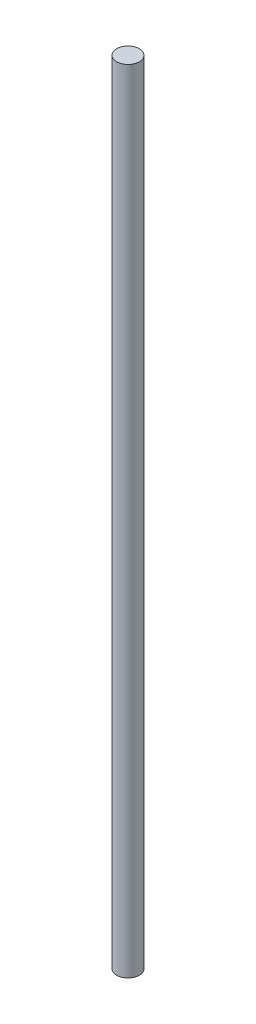
ISO-10303-21;
HEADER;
FILE_DESCRIPTION(('STEP AP214'),'2;1');
FILE_NAME('part.step','',(''),(''),'','','');
FILE_SCHEMA(('AUTOMOTIVE_DESIGN { 1 0 10303 214 1 1 1 1 }'));
ENDSEC;
DATA;
#1=APPLICATION_CONTEXT('core data for automotive mechanical design processes');
#2=APPLICATION_PROTOCOL_DEFINITION('international standard','automotive_design',2000,#1);
#3=PRODUCT_CONTEXT('',#1,'mechanical');
#4=PRODUCT('Part','Part','',(#3));
#5=PRODUCT_RELATED_PRODUCT_CATEGORY('part','',(#4));
#6=PRODUCT_DEFINITION_FORMATION('','',#4);
#7=PRODUCT_DEFINITION_CONTEXT('part definition',#1,'design');
#8=PRODUCT_DEFINITION('design','',#6,#7);
#9=PRODUCT_DEFINITION_SHAPE('','',#8);
#10=(LENGTH_UNIT() NAMED_UNIT(*) SI_UNIT(.MILLI.,.METRE.));
#11=(NAMED_UNIT(*) PLANE_ANGLE_UNIT() SI_UNIT($,.RADIAN.));
#12=(NAMED_UNIT(*) SI_UNIT($,.STERADIAN.) SOLID_ANGLE_UNIT());
#13=UNCERTAINTY_MEASURE_WITH_UNIT(LENGTH_MEASURE(1.E-05),#10,'distance_accuracy_value','');
#14=(GEOMETRIC_REPRESENTATION_CONTEXT(3) GLOBAL_UNCERTAINTY_ASSIGNED_CONTEXT((#13)) GLOBAL_UNIT_ASSIGNED_CONTEXT((#10,
#11,#12)) REPRESENTATION_CONTEXT('',''));
#15=CARTESIAN_POINT('',(0.,0.,0.));
#16=DIRECTION('',(0.,0.,1.));
#17=DIRECTION('',(1.,0.,0.));
#18=AXIS2_PLACEMENT_3D('',#15,#16,#17);
#19=CARTESIAN_POINT('',(0.,700.,0.));
#20=DIRECTION('',(0.,-1.,0.));
#21=DIRECTION('',(0.,0.,-1.));
#22=AXIS2_PLACEMENT_3D('',#19,#20,#21);
#23=CYLINDRICAL_SURFACE('',#22,10.);
#24=CARTESIAN_POINT('',(0.,700.,0.));
#25=DIRECTION('',(0.,1.,0.));
#26=DIRECTION('',(0.,0.,1.));
#27=AXIS2_PLACEMENT_3D('',#24,#25,#26);
#28=CIRCLE('',#27,10.);
#29=CARTESIAN_POINT('',(0.,700.,10.));
#30=VERTEX_POINT('',#29);
#31=EDGE_CURVE('E10',#30,#30,#28,.T.);
#32=ORIENTED_EDGE('',*,*,#31,.F.);
#33=EDGE_LOOP('',(#32));
#34=FACE_BOUND('',#33,.T.);
#35=CARTESIAN_POINT('',(0.,0.,0.));
#36=DIRECTION('',(0.,1.,0.));
#37=DIRECTION('',(0.,0.,1.));
#38=AXIS2_PLACEMENT_3D('',#35,#36,#37);
#39=CIRCLE('',#38,10.);
#40=CARTESIAN_POINT('',(0.,0.,10.));
#41=VERTEX_POINT('',#40);
#42=EDGE_CURVE('E40',#41,#41,#39,.T.);
#43=ORIENTED_EDGE('',*,*,#42,.T.);
#44=EDGE_LOOP('',(#43));
#45=FACE_BOUND('',#44,.T.);
#46=ADVANCED_FACE('F37',(#34,#45),#23,.T.);
#47=CARTESIAN_POINT('',(0.,700.,0.));
#48=DIRECTION('',(0.,1.,0.));
#49=DIRECTION('',(0.,0.,1.));
#50=AXIS2_PLACEMENT_3D('',#47,#48,#49);
#51=PLANE('',#50);
#52=ORIENTED_EDGE('',*,*,#31,.T.);
#53=EDGE_LOOP('',(#52));
#54=FACE_BOUND('',#53,.T.);
#55=ADVANCED_FACE('F54',(#54),#51,.T.);
#56=CARTESIAN_POINT('',(0.,0.,0.));
#57=DIRECTION('',(0.,1.,0.));
#58=DIRECTION('',(0.,0.,1.));
#59=AXIS2_PLACEMENT_3D('',#56,#57,#58);
#60=PLANE('',#59);
#61=ORIENTED_EDGE('',*,*,#42,.F.);
#62=EDGE_LOOP('',(#61));
#63=FACE_BOUND('',#62,.T.);
#64=ADVANCED_FACE('F52',(#63),#60,.F.);
#65=CLOSED_SHELL('',(#46,#55,#64));
#66=MANIFOLD_SOLID_BREP('B2',#65);
#67=ADVANCED_BREP_SHAPE_REPRESENTATION('',(#18,#66),#14);
#68=SHAPE_DEFINITION_REPRESENTATION(#9,#67);
ENDSEC;
END-ISO-10303-21;
